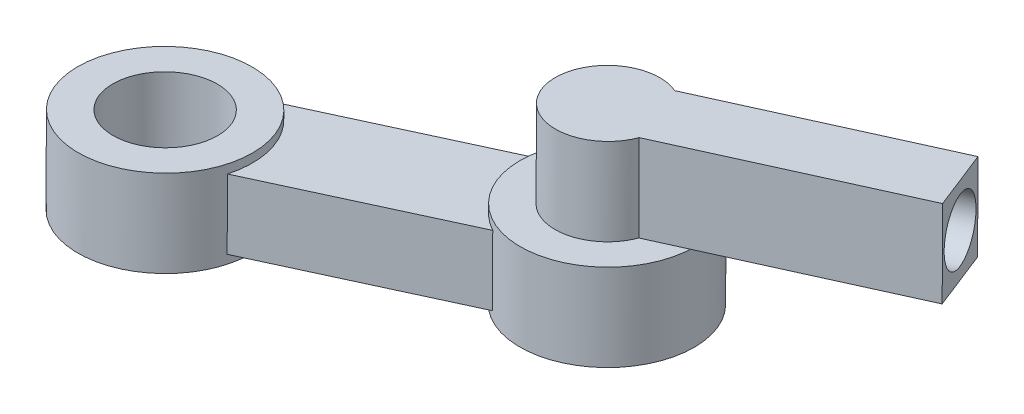
ISO-10303-21;
HEADER;
FILE_DESCRIPTION(('STEP AP214'),'2;1');
FILE_NAME('part.step','',(''),(''),'','','');
FILE_SCHEMA(('AUTOMOTIVE_DESIGN { 1 0 10303 214 1 1 1 1 }'));
ENDSEC;
DATA;
#1=APPLICATION_CONTEXT('core data for automotive mechanical design processes');
#2=APPLICATION_PROTOCOL_DEFINITION('international standard','automotive_design',2000,#1);
#3=PRODUCT_CONTEXT('',#1,'mechanical');
#4=PRODUCT('Part','Part','',(#3));
#5=PRODUCT_RELATED_PRODUCT_CATEGORY('part','',(#4));
#6=PRODUCT_DEFINITION_FORMATION('','',#4);
#7=PRODUCT_DEFINITION_CONTEXT('part definition',#1,'design');
#8=PRODUCT_DEFINITION('design','',#6,#7);
#9=PRODUCT_DEFINITION_SHAPE('','',#8);
#10=(LENGTH_UNIT() NAMED_UNIT(*) SI_UNIT(.MILLI.,.METRE.));
#11=(NAMED_UNIT(*) PLANE_ANGLE_UNIT() SI_UNIT($,.RADIAN.));
#12=(NAMED_UNIT(*) SI_UNIT($,.STERADIAN.) SOLID_ANGLE_UNIT());
#13=UNCERTAINTY_MEASURE_WITH_UNIT(LENGTH_MEASURE(1.E-05),#10,'distance_accuracy_value','');
#14=(GEOMETRIC_REPRESENTATION_CONTEXT(3) GLOBAL_UNCERTAINTY_ASSIGNED_CONTEXT((#13)) GLOBAL_UNIT_ASSIGNED_CONTEXT((#10,
#11,#12)) REPRESENTATION_CONTEXT('',''));
#15=CARTESIAN_POINT('',(0.,0.,0.));
#16=DIRECTION('',(0.,0.,1.));
#17=DIRECTION('',(1.,0.,0.));
#18=AXIS2_PLACEMENT_3D('',#15,#16,#17);
#19=CARTESIAN_POINT('',(151.701359540284,43.9127143912084,107.787056538677));
#20=DIRECTION('',(0.398693533684162,0.0497378245111538,0.915734467523929));
#21=DIRECTION('',(-0.0344593521490595,0.998635550345111,-0.0392376176186142));
#22=AXIS2_PLACEMENT_3D('',#19,#20,#21);
#23=PLANE('',#22);
#24=DIRECTION('',(-0.916436587685096,-0.0159118320697253,0.399863469639678));
#25=VECTOR('',#24,1.);
#26=CARTESIAN_POINT('',(152.390546583265,23.9400033843061,108.57180889105));
#27=LINE('',#26,#25);
#28=CARTESIAN_POINT('',(134.061814829564,23.6217667429116,116.569078283843));
#29=VERTEX_POINT('',#28);
#30=CARTESIAN_POINT('',(79.0756195684577,22.6670568187281,140.560886462224));
#31=VERTEX_POINT('',#30);
#32=EDGE_CURVE('P0_E65',#29,#31,#27,.T.);
#33=ORIENTED_EDGE('',*,*,#32,.F.);
#34=DIRECTION('',(0.0344593521490595,-0.998635550345111,0.0392376176186142));
#35=VECTOR('',#34,1.);
#36=CARTESIAN_POINT('',(133.28647940621,46.0910666256766,115.686231887424));
#37=LINE('',#36,#35);
#38=CARTESIAN_POINT('',(133.372627786582,43.5944777498139,115.784325931471));
#39=VERTEX_POINT('',#38);
#40=EDGE_CURVE('P0_E58',#29,#39,#37,.F.);
#41=ORIENTED_EDGE('',*,*,#40,.T.);
#42=DIRECTION('',(-0.916436587685096,-0.0159118320697253,0.399863469639678));
#43=VECTOR('',#42,1.);
#44=CARTESIAN_POINT('',(151.701359540284,43.9127143912084,107.787056538677));
#45=LINE('',#44,#43);
#46=CARTESIAN_POINT('',(78.3864325254766,42.6397678256303,139.776134109852));
#47=VERTEX_POINT('',#46);
#48=EDGE_CURVE('P0_E64',#39,#47,#45,.T.);
#49=ORIENTED_EDGE('',*,*,#48,.T.);
#50=DIRECTION('',(0.0344593521490595,-0.998635550345111,0.0392376176186142));
#51=VECTOR('',#50,1.);
#52=CARTESIAN_POINT('',(78.3002841451039,45.1363567014931,139.678040065805));
#53=LINE('',#52,#51);
#54=EDGE_CURVE('P0_E85',#31,#47,#53,.F.);
#55=ORIENTED_EDGE('',*,*,#54,.F.);
#56=EDGE_LOOP('',(#33,#41,#49,#55));
#57=FACE_BOUND('',#56,.T.);
#58=ADVANCED_FACE('P0_F17',(#57),#23,.T.);
#59=CARTESIAN_POINT('',(139.740553529759,42.4205796558737,80.3150225129594));
#60=DIRECTION('',(-0.398693533684162,-0.0497378245111538,-0.915734467523929));
#61=DIRECTION('',(0.0344593521490595,-0.998635550345111,0.0392376176186142));
#62=AXIS2_PLACEMENT_3D('',#59,#60,#61);
#63=PLANE('',#62);
#64=DIRECTION('',(-0.916436587685096,-0.0159118320697253,0.399863469639678));
#65=VECTOR('',#64,1.);
#66=CARTESIAN_POINT('',(139.740553529759,42.4205796558737,80.3150225129594));
#67=LINE('',#66,#65);
#68=CARTESIAN_POINT('',(121.411821776057,42.1023430144792,88.312291905753));
#69=VERTEX_POINT('',#68);
#70=CARTESIAN_POINT('',(66.4256265149517,41.1476330902957,112.304100084134));
#71=VERTEX_POINT('',#70);
#72=EDGE_CURVE('P0_E38',#69,#71,#67,.T.);
#73=ORIENTED_EDGE('',*,*,#72,.F.);
#74=DIRECTION('',(0.0344593521490595,-0.998635550345111,0.0392376176186142));
#75=VECTOR('',#74,1.);
#76=CARTESIAN_POINT('',(121.325673395685,44.598931890342,88.2141978617065));
#77=LINE('',#76,#75);
#78=CARTESIAN_POINT('',(122.101008819039,22.129632007577,89.0970442581253));
#79=VERTEX_POINT('',#78);
#80=EDGE_CURVE('P0_E32',#69,#79,#77,.T.);
#81=ORIENTED_EDGE('',*,*,#80,.T.);
#82=DIRECTION('',(-0.916436587685096,-0.0159118320697253,0.399863469639678));
#83=VECTOR('',#82,1.);
#84=CARTESIAN_POINT('',(140.429740572741,22.4478686489715,81.0997748653317));
#85=LINE('',#84,#83);
#86=CARTESIAN_POINT('',(67.1148135579329,21.1749220833935,113.088852436506));
#87=VERTEX_POINT('',#86);
#88=EDGE_CURVE('P0_E73',#79,#87,#85,.T.);
#89=ORIENTED_EDGE('',*,*,#88,.T.);
#90=DIRECTION('',(0.0344593521490595,-0.998635550345111,0.0392376176186142));
#91=VECTOR('',#90,1.);
#92=CARTESIAN_POINT('',(66.3394781345791,43.6442219661585,112.206006040087));
#93=LINE('',#92,#91);
#94=EDGE_CURVE('P0_E79',#71,#87,#93,.T.);
#95=ORIENTED_EDGE('',*,*,#94,.F.);
#96=EDGE_LOOP('',(#73,#81,#89,#95));
#97=FACE_BOUND('',#96,.T.);
#98=ADVANCED_FACE('P0_F121',(#97),#63,.T.);
#99=CARTESIAN_POINT('',(53.9911493861395,44.0720526924313,133.93929244574));
#100=DIRECTION('',(-0.0344593521490595,0.998635550345111,-0.0392376176186142));
#101=DIRECTION('',(-0.398693533684162,-0.0497378245111538,-0.915734467523929));
#102=AXIS2_PLACEMENT_3D('',#99,#100,#101);
#103=PLANE('',#102);
#104=CARTESIAN_POINT('',(53.9911493861395,44.0720526924313,133.93929244574));
#105=DIRECTION('',(-0.0344593521490595,0.998635550345111,-0.0392376176186142));
#106=DIRECTION('',(-0.398693533684162,-0.0497378245111538,-0.915734467523929));
#107=AXIS2_PLACEMENT_3D('',#104,#105,#106);
#108=CIRCLE('',#107,25.);
#109=CARTESIAN_POINT('',(44.0238110440355,42.8286070796525,111.045930757641));
#110=VERTEX_POINT('',#109);
#111=EDGE_CURVE('P0_E25',#110,#110,#108,.T.);
#112=ORIENTED_EDGE('',*,*,#111,.T.);
#113=EDGE_LOOP('',(#112));
#114=FACE_BOUND('',#113,.T.);
#115=CARTESIAN_POINT('',(53.9911493861395,44.0720526924313,133.93929244574));
#116=DIRECTION('',(-0.0344593521490595,0.998635550345111,-0.0392376176186142));
#117=DIRECTION('',(-0.398693533684162,-0.0497378245111538,-0.915734467523929));
#118=AXIS2_PLACEMENT_3D('',#115,#116,#117);
#119=CIRCLE('',#118,15.);
#120=CARTESIAN_POINT('',(59.971552391402,44.8181200600986,147.675309458599));
#121=VERTEX_POINT('',#120);
#122=EDGE_CURVE('P0_E88',#121,#121,#119,.T.);
#123=ORIENTED_EDGE('',*,*,#122,.F.);
#124=EDGE_LOOP('',(#123));
#125=FACE_BOUND('',#124,.T.);
#126=ADVANCED_FACE('P0_F102',(#114,#125),#103,.T.);
#127=CARTESIAN_POINT('',(54.852633189866,19.1061639338035,134.920232886205));
#128=DIRECTION('',(-0.0344593521490595,0.998635550345111,-0.0392376176186142));
#129=DIRECTION('',(-0.398693533684162,-0.0497378245111538,-0.915734467523929));
#130=AXIS2_PLACEMENT_3D('',#127,#128,#129);
#131=PLANE('',#130);
#132=CARTESIAN_POINT('',(54.852633189866,19.1061639338035,134.920232886205));
#133=DIRECTION('',(-0.0344593521490595,0.998635550345111,-0.0392376176186142));
#134=DIRECTION('',(-0.398693533684162,-0.0497378245111538,-0.915734467523929));
#135=AXIS2_PLACEMENT_3D('',#132,#133,#134);
#136=CIRCLE('',#135,25.);
#137=CARTESIAN_POINT('',(44.885294847762,17.8627183210247,112.026871198107));
#138=VERTEX_POINT('',#137);
#139=EDGE_CURVE('P0_E91',#138,#138,#136,.T.);
#140=ORIENTED_EDGE('',*,*,#139,.F.);
#141=EDGE_LOOP('',(#140));
#142=FACE_BOUND('',#141,.T.);
#143=CARTESIAN_POINT('',(54.852633189866,19.1061639338035,134.920232886205));
#144=DIRECTION('',(-0.0344593521490595,0.998635550345111,-0.0392376176186142));
#145=DIRECTION('',(-0.398693533684162,-0.0497378245111538,-0.915734467523929));
#146=AXIS2_PLACEMENT_3D('',#143,#144,#145);
#147=CIRCLE('',#146,15.);
#148=CARTESIAN_POINT('',(60.8330361951285,19.8522313014708,148.656249899064));
#149=VERTEX_POINT('',#148);
#150=EDGE_CURVE('P0_E87',#149,#149,#147,.T.);
#151=ORIENTED_EDGE('',*,*,#150,.T.);
#152=EDGE_LOOP('',(#151));
#153=FACE_BOUND('',#152,.T.);
#154=ADVANCED_FACE('P0_F99',(#142,#153),#131,.F.);
#155=CARTESIAN_POINT('',(53.9911493861395,44.0720526924313,133.93929244574));
#156=DIRECTION('',(0.0344593521490595,-0.998635550345111,0.0392376176186142));
#157=DIRECTION('',(0.398693533684162,0.0497378245111538,0.915734467523929));
#158=AXIS2_PLACEMENT_3D('',#155,#156,#157);
#159=CYLINDRICAL_SURFACE('',#158,25.);
#160=CARTESIAN_POINT('',(54.7664848094934,21.6027528096663,134.822138842158));
#161=DIRECTION('',(0.0344593521490596,-0.998635550345111,0.0392376176186143));
#162=DIRECTION('',(0.398693533684162,0.0497378245111539,0.915734467523929));
#163=AXIS2_PLACEMENT_3D('',#160,#161,#162);
#164=CIRCLE('',#163,25.);
#165=EDGE_CURVE('P0_E82',#87,#31,#164,.T.);
#166=ORIENTED_EDGE('',*,*,#165,.T.);
#167=ORIENTED_EDGE('',*,*,#54,.T.);
#168=CARTESIAN_POINT('',(54.0772977665122,41.5754638165685,134.037386489786));
#169=DIRECTION('',(-0.0344593521490596,0.998635550345111,-0.0392376176186143));
#170=DIRECTION('',(-0.398693533684162,-0.0497378245111539,-0.915734467523929));
#171=AXIS2_PLACEMENT_3D('',#168,#169,#170);
#172=CIRCLE('',#171,25.);
#173=EDGE_CURVE('P0_E70',#47,#71,#172,.T.);
#174=ORIENTED_EDGE('',*,*,#173,.T.);
#175=ORIENTED_EDGE('',*,*,#94,.T.);
#176=EDGE_LOOP('',(#166,#167,#174,#175));
#177=FACE_BOUND('',#176,.T.);
#178=ORIENTED_EDGE('',*,*,#111,.F.);
#179=EDGE_LOOP('',(#178));
#180=FACE_BOUND('',#179,.T.);
#181=ORIENTED_EDGE('',*,*,#139,.T.);
#182=EDGE_LOOP('',(#181));
#183=FACE_BOUND('',#182,.T.);
#184=ADVANCED_FACE('P0_F19',(#177,#180,#183),#159,.T.);
#185=CARTESIAN_POINT('',(53.9911493861395,44.0720526924313,133.93929244574));
#186=DIRECTION('',(0.0344593521490595,-0.998635550345111,0.0392376176186142));
#187=DIRECTION('',(0.398693533684162,0.0497378245111538,0.915734467523929));
#188=AXIS2_PLACEMENT_3D('',#185,#186,#187);
#189=CYLINDRICAL_SURFACE('',#188,15.);
#190=CARTESIAN_POINT('',(59.971552391402,44.8181200600986,147.675309458599));
#191=CARTESIAN_POINT('',(59.9805261810241,44.5580587188629,147.685527588187));
#192=CARTESIAN_POINT('',(59.9894999706463,44.2979973776272,147.695745717775));
#193=CARTESIAN_POINT('',(60.0074475498906,43.7778746951558,147.716181976951));
#194=CARTESIAN_POINT('',(60.0164213395127,43.5178133539201,147.726400106539));
#195=CARTESIAN_POINT('',(60.034368918757,42.9976906714487,147.746836365716));
#196=CARTESIAN_POINT('',(60.0433427083792,42.737629330213,147.757054495304));
#197=CARTESIAN_POINT('',(60.0612902876235,42.2175066477416,147.77749075448));
#198=CARTESIAN_POINT('',(60.0702640772456,41.9574453065058,147.787708884069));
#199=CARTESIAN_POINT('',(60.0882116564899,41.4373226240344,147.808145143245));
#200=CARTESIAN_POINT('',(60.0971854461121,41.1772612827987,147.818363272833));
#201=CARTESIAN_POINT('',(60.1151330253564,40.6571386003273,147.838799532009));
#202=CARTESIAN_POINT('',(60.1241068149785,40.3970772590916,147.849017661598));
#203=CARTESIAN_POINT('',(60.1420543942228,39.8769545766202,147.869453920774));
#204=CARTESIAN_POINT('',(60.151028183845,39.6168932353845,147.879672050362));
#205=CARTESIAN_POINT('',(60.1689757630893,39.0967705529131,147.900108309539));
#206=CARTESIAN_POINT('',(60.1779495527114,38.8367092116774,147.910326439127));
#207=CARTESIAN_POINT('',(60.1958971319558,38.316586529206,147.930762698303));
#208=CARTESIAN_POINT('',(60.2048709215779,38.0565251879703,147.940980827891));
#209=CARTESIAN_POINT('',(60.2228185008222,37.5364025054988,147.961417087068));
#210=CARTESIAN_POINT('',(60.2317922904443,37.2763411642631,147.971635216656));
#211=CARTESIAN_POINT('',(60.2497398696887,36.7562184817917,147.992071475832));
#212=CARTESIAN_POINT('',(60.2587136593108,36.496157140556,148.00228960542));
#213=CARTESIAN_POINT('',(60.2766612385551,35.9760344580846,148.022725864597));
#214=CARTESIAN_POINT('',(60.2856350281773,35.7159731168489,148.032943994185));
#215=CARTESIAN_POINT('',(60.3035826074216,35.1958504343775,148.053380253361));
#216=CARTESIAN_POINT('',(60.3125563970437,34.9357890931418,148.063598382949));
#217=CARTESIAN_POINT('',(60.330503976288,34.4156664106704,148.084034642126));
#218=CARTESIAN_POINT('',(60.3394777659102,34.1556050694347,148.094252771714));
#219=CARTESIAN_POINT('',(60.3574253451545,33.6354823869632,148.11468903089));
#220=CARTESIAN_POINT('',(60.3663991347766,33.3754210457275,148.124907160479));
#221=CARTESIAN_POINT('',(60.3843467140209,32.8552983632561,148.145343419655));
#222=CARTESIAN_POINT('',(60.3933205036431,32.5952370220204,148.155561549243));
#223=CARTESIAN_POINT('',(60.4112680828874,32.075114339549,148.175997808419));
#224=CARTESIAN_POINT('',(60.4202418725095,31.8150529983133,148.186215938008));
#225=CARTESIAN_POINT('',(60.4381894517538,31.2949303158419,148.206652197184));
#226=CARTESIAN_POINT('',(60.447163241376,31.0348689746062,148.216870326772));
#227=CARTESIAN_POINT('',(60.4651108206203,30.5147462921348,148.237306585949));
#228=CARTESIAN_POINT('',(60.4740846102424,30.2546849508991,148.247524715537));
#229=CARTESIAN_POINT('',(60.4920321894867,29.7345622684277,148.267960974713));
#230=CARTESIAN_POINT('',(60.5010059791089,29.474500927192,148.278179104301));
#231=CARTESIAN_POINT('',(60.5189535583532,28.9543782447205,148.298615363478));
#232=CARTESIAN_POINT('',(60.5279273479753,28.6943169034848,148.308833493066));
#233=CARTESIAN_POINT('',(60.5458749272196,28.1741942210134,148.329269752242));
#234=CARTESIAN_POINT('',(60.5548487168418,27.9141328797777,148.33948788183));
#235=CARTESIAN_POINT('',(60.5727962960861,27.3940101973063,148.359924141007));
#236=CARTESIAN_POINT('',(60.5817700857082,27.1339488560706,148.370142270595));
#237=CARTESIAN_POINT('',(60.5997176649525,26.6138261735992,148.390578529771));
#238=CARTESIAN_POINT('',(60.6086914545747,26.3537648323635,148.400796659359));
#239=CARTESIAN_POINT('',(60.626639033819,25.8336421498921,148.421232918536));
#240=CARTESIAN_POINT('',(60.6356128234411,25.5735808086564,148.431451048124));
#241=CARTESIAN_POINT('',(60.6535604026854,25.053458126185,148.4518873073));
#242=CARTESIAN_POINT('',(60.6625341923076,24.7933967849492,148.462105436889));
#243=CARTESIAN_POINT('',(60.6804817715519,24.2732741024778,148.482541696065));
#244=CARTESIAN_POINT('',(60.6894555611741,24.0132127612421,148.492759825653));
#245=CARTESIAN_POINT('',(60.7074031404183,23.4930900787707,148.513196084829));
#246=CARTESIAN_POINT('',(60.7163769300405,23.233028737535,148.523414214418));
#247=CARTESIAN_POINT('',(60.7343245092848,22.7129060550636,148.543850473594));
#248=CARTESIAN_POINT('',(60.743298298907,22.4528447138279,148.554068603182));
#249=CARTESIAN_POINT('',(60.7612458781513,21.9327220313565,148.574504862358));
#250=CARTESIAN_POINT('',(60.7702196677734,21.6726606901208,148.584722991947));
#251=CARTESIAN_POINT('',(60.7881672470177,21.1525380076494,148.605159251123));
#252=CARTESIAN_POINT('',(60.7971410366399,20.8924766664137,148.615377380711));
#253=CARTESIAN_POINT('',(60.8150886158842,20.3723539839422,148.635813639888));
#254=CARTESIAN_POINT('',(60.8240624055063,20.1122926427065,148.646031769476));
#255=CARTESIAN_POINT('',(60.8330361951285,19.8522313014708,148.656249899064));
#256=B_SPLINE_CURVE_WITH_KNOTS('',3,(#190,#191,#192,#193,#194,#195,#196,#197,#198,#199,#200,
#201,#202,#203,#204,#205,#206,#207,#208,#209,#210,#211,#212,#213,#214,#215,#216,#217,#218,#219,
#220,#221,#222,#223,#224,#225,#226,#227,#228,#229,#230,#231,#232,#233,#234,#235,#236,#237,#238,
#239,#240,#241,#242,#243,#244,#245,#246,#247,#248,#249,#250,#251,#252,#253,#254,#255),
.UNSPECIFIED.,.F.,.F.,(4,2,2,2,2,2,2,2,2,2,2,2,2,2,2,2,2,2,2,2,2,2,2,2,2,2,2,2,2,2,2,2,4),(0.,
0.781250000000005,1.5625,2.34375,3.125,3.90625,4.6875,5.46875000000001,6.25000000000001,7.03125,
7.81250000000001,8.59375000000001,9.37500000000001,10.15625,10.9375,11.71875,12.5,13.28125,
14.0625,14.84375,15.625,16.40625,17.1875,17.96875,18.75,19.53125,20.3125,21.09375,21.875,
22.65625,23.4375,24.21875,25.),.UNSPECIFIED.);
#257=EDGE_CURVE('P0_BSEAM105',#121,#149,#256,.T.);
#258=ORIENTED_EDGE('',*,*,#122,.T.);
#259=ORIENTED_EDGE('',*,*,#150,.F.);
#260=ORIENTED_EDGE('',*,*,#257,.T.);
#261=ORIENTED_EDGE('',*,*,#257,.F.);
#262=EDGE_LOOP('',(#258,#260,#259,#261));
#263=FACE_BOUND('',#262,.T.);
#264=ADVANCED_FACE('P0_F105',(#263),#189,.F.);
#265=CARTESIAN_POINT('',(140.429740572741,22.4478686489715,81.0997748653317));
#266=DIRECTION('',(0.0344593521490596,-0.998635550345111,0.0392376176186143));
#267=DIRECTION('',(0.398693533684162,0.0497378245111539,0.915734467523929));
#268=AXIS2_PLACEMENT_3D('',#265,#266,#267);
#269=PLANE('',#268);
#270=ORIENTED_EDGE('',*,*,#88,.F.);
#271=CARTESIAN_POINT('',(146.410143578003,23.1939360166388,94.8357918781907));
#272=DIRECTION('',(0.0344593521490596,-0.998635550345111,0.0392376176186143));
#273=DIRECTION('',(0.398693533684162,0.0497378245111539,0.915734467523929));
#274=AXIS2_PLACEMENT_3D('',#271,#272,#273);
#275=CIRCLE('',#274,25.);
#276=EDGE_CURVE('P0_E66',#79,#29,#275,.F.);
#277=ORIENTED_EDGE('',*,*,#276,.T.);
#278=ORIENTED_EDGE('',*,*,#32,.T.);
#279=ORIENTED_EDGE('',*,*,#165,.F.);
#280=EDGE_LOOP('',(#270,#277,#278,#279));
#281=FACE_BOUND('',#280,.T.);
#282=ADVANCED_FACE('P0_F107',(#281),#269,.T.);
#283=CARTESIAN_POINT('',(139.740553529759,42.4205796558737,80.3150225129594));
#284=DIRECTION('',(-0.0344593521490596,0.998635550345111,-0.0392376176186143));
#285=DIRECTION('',(-0.398693533684162,-0.0497378245111539,-0.915734467523929));
#286=AXIS2_PLACEMENT_3D('',#283,#284,#285);
#287=PLANE('',#286);
#288=ORIENTED_EDGE('',*,*,#48,.F.);
#289=CARTESIAN_POINT('',(145.720956535022,43.166647023541,94.0510395258184));
#290=DIRECTION('',(-0.0344593521490596,0.998635550345111,-0.0392376176186143));
#291=DIRECTION('',(-0.398693533684162,-0.0497378245111539,-0.915734467523929));
#292=AXIS2_PLACEMENT_3D('',#289,#290,#291);
#293=CIRCLE('',#292,25.);
#294=EDGE_CURVE('P0_E11',#39,#69,#293,.F.);
#295=ORIENTED_EDGE('',*,*,#294,.T.);
#296=ORIENTED_EDGE('',*,*,#72,.T.);
#297=ORIENTED_EDGE('',*,*,#173,.F.);
#298=EDGE_LOOP('',(#288,#295,#296,#297));
#299=FACE_BOUND('',#298,.T.);
#300=ADVANCED_FACE('P0_F68',(#299),#287,.T.);
#301=CARTESIAN_POINT('',(145.634808154649,45.6632358994038,93.9529454817718));
#302=DIRECTION('',(0.0344593521490595,-0.998635550345111,0.0392376176186142));
#303=DIRECTION('',(0.398693533684162,0.0497378245111538,0.915734467523929));
#304=AXIS2_PLACEMENT_3D('',#301,#302,#303);
#305=CYLINDRICAL_SURFACE('',#304,15.);
#306=CARTESIAN_POINT('',(146.496291958376,20.6973471407761,94.9338859222372));
#307=DIRECTION('',(-0.0344593521490595,0.998635550345111,-0.0392376176186142));
#308=DIRECTION('',(-0.398693533684162,-0.0497378245111538,-0.915734467523929));
#309=AXIS2_PLACEMENT_3D('',#306,#307,#308);
#310=CIRCLE('',#309,15.);
#311=CARTESIAN_POINT('',(152.476694963638,21.4434145084434,108.669902935096));
#312=VERTEX_POINT('',#311);
#313=EDGE_CURVE('P0_E148',#312,#312,#310,.T.);
#314=CARTESIAN_POINT('',(145.634808154649,45.6632358994038,93.9529454817718));
#315=DIRECTION('',(-0.0344593521490595,0.998635550345111,-0.0392376176186142));
#316=DIRECTION('',(-0.398693533684162,-0.0497378245111538,-0.915734467523929));
#317=AXIS2_PLACEMENT_3D('',#314,#315,#316);
#318=CIRCLE('',#317,15.);
#319=CARTESIAN_POINT('',(151.615211159912,46.4093032670711,107.688962494631));
#320=VERTEX_POINT('',#319);
#321=EDGE_CURVE('P0_E151',#320,#320,#318,.T.);
#322=CARTESIAN_POINT('',(152.476694963638,21.4434145084434,108.669902935096));
#323=CARTESIAN_POINT('',(152.467721174016,21.7034758496791,108.659684805508));
#324=CARTESIAN_POINT('',(152.458747384394,21.9635371909148,108.64946667592));
#325=CARTESIAN_POINT('',(152.440799805149,22.4836598733862,108.629030416743));
#326=CARTESIAN_POINT('',(152.431826015527,22.7437212146219,108.618812287155));
#327=CARTESIAN_POINT('',(152.413878436283,23.2638438970933,108.598376027979));
#328=CARTESIAN_POINT('',(152.404904646661,23.523905238329,108.588157898391));
#329=CARTESIAN_POINT('',(152.386957067417,24.0440279208004,108.567721639214));
#330=CARTESIAN_POINT('',(152.377983277794,24.3040892620361,108.557503509626));
#331=CARTESIAN_POINT('',(152.36003569855,24.8242119445075,108.53706725045));
#332=CARTESIAN_POINT('',(152.351061908928,25.0842732857432,108.526849120862));
#333=CARTESIAN_POINT('',(152.333114329684,25.6043959682147,108.506412861685));
#334=CARTESIAN_POINT('',(152.324140540061,25.8644573094504,108.496194732097));
#335=CARTESIAN_POINT('',(152.306192960817,26.3845799919218,108.475758472921));
#336=CARTESIAN_POINT('',(152.297219171195,26.6446413331575,108.465540343332));
#337=CARTESIAN_POINT('',(152.279271591951,27.1647640156289,108.445104084156));
#338=CARTESIAN_POINT('',(152.270297802329,27.4248253568646,108.434885954568));
#339=CARTESIAN_POINT('',(152.252350223084,27.944948039336,108.414449695392));
#340=CARTESIAN_POINT('',(152.243376433462,28.2050093805717,108.404231565803));
#341=CARTESIAN_POINT('',(152.225428854218,28.7251320630431,108.383795306627));
#342=CARTESIAN_POINT('',(152.216455064596,28.9851934042788,108.373577177039));
#343=CARTESIAN_POINT('',(152.198507485351,29.5053160867502,108.353140917863));
#344=CARTESIAN_POINT('',(152.189533695729,29.7653774279859,108.342922788274));
#345=CARTESIAN_POINT('',(152.171586116485,30.2855001104574,108.322486529098));
#346=CARTESIAN_POINT('',(152.162612326863,30.5455614516931,108.31226839951));
#347=CARTESIAN_POINT('',(152.144664747619,31.0656841341645,108.291832140333));
#348=CARTESIAN_POINT('',(152.135690957996,31.3257454754002,108.281614010745));
#349=CARTESIAN_POINT('',(152.117743378752,31.8458681578716,108.261177751569));
#350=CARTESIAN_POINT('',(152.10876958913,32.1059294991073,108.250959621981));
#351=CARTESIAN_POINT('',(152.090822009886,32.6260521815787,108.230523362804));
#352=CARTESIAN_POINT('',(152.081848220263,32.8861135228144,108.220305233216));
#353=CARTESIAN_POINT('',(152.063900641019,33.4062362052858,108.19986897404));
#354=CARTESIAN_POINT('',(152.054926851397,33.6662975465215,108.189650844452));
#355=CARTESIAN_POINT('',(152.036979272153,34.186420228993,108.169214585275));
#356=CARTESIAN_POINT('',(152.028005482531,34.4464815702287,108.158996455687));
#357=CARTESIAN_POINT('',(152.010057903286,34.9666042527001,108.138560196511));
#358=CARTESIAN_POINT('',(152.001084113664,35.2266655939358,108.128342066923));
#359=CARTESIAN_POINT('',(151.98313653442,35.7467882764072,108.107905807746));
#360=CARTESIAN_POINT('',(151.974162744798,36.0068496176429,108.097687678158));
#361=CARTESIAN_POINT('',(151.956215165553,36.5269723001143,108.077251418982));
#362=CARTESIAN_POINT('',(151.947241375931,36.78703364135,108.067033289393));
#363=CARTESIAN_POINT('',(151.929293796687,37.3071563238214,108.046597030217));
#364=CARTESIAN_POINT('',(151.920320007065,37.5672176650571,108.036378900629));
#365=CARTESIAN_POINT('',(151.90237242782,38.0873403475285,108.015942641453));
#366=CARTESIAN_POINT('',(151.893398638198,38.3474016887643,108.005724511864));
#367=CARTESIAN_POINT('',(151.875451058954,38.8675243712357,107.985288252688));
#368=CARTESIAN_POINT('',(151.866477269332,39.1275857124714,107.9750701231));
#369=CARTESIAN_POINT('',(151.848529690088,39.6477083949428,107.954633863923));
#370=CARTESIAN_POINT('',(151.839555900465,39.9077697361785,107.944415734335));
#371=CARTESIAN_POINT('',(151.821608321221,40.4278924186499,107.923979475159));
#372=CARTESIAN_POINT('',(151.812634531599,40.6879537598856,107.913761345571));
#373=CARTESIAN_POINT('',(151.794686952355,41.208076442357,107.893325086394));
#374=CARTESIAN_POINT('',(151.785713162732,41.4681377835927,107.883106956806));
#375=CARTESIAN_POINT('',(151.767765583488,41.9882604660641,107.86267069763));
#376=CARTESIAN_POINT('',(151.758791793866,42.2483218072998,107.852452568042));
#377=CARTESIAN_POINT('',(151.740844214622,42.7684444897712,107.832016308865));
#378=CARTESIAN_POINT('',(151.731870425,43.028505831007,107.821798179277));
#379=CARTESIAN_POINT('',(151.713922845755,43.5486285134784,107.801361920101));
#380=CARTESIAN_POINT('',(151.704949056133,43.8086898547141,107.791143790513));
#381=CARTESIAN_POINT('',(151.687001476889,44.3288125371855,107.770707531336));
#382=CARTESIAN_POINT('',(151.678027687267,44.5888738784212,107.760489401748));
#383=CARTESIAN_POINT('',(151.660080108022,45.1089965608926,107.740053142572));
#384=CARTESIAN_POINT('',(151.6511063184,45.3690579021283,107.729835012983));
#385=CARTESIAN_POINT('',(151.633158739156,45.8891805845997,107.709398753807));
#386=CARTESIAN_POINT('',(151.624184949534,46.1492419258354,107.699180624219));
#387=CARTESIAN_POINT('',(151.615211159912,46.4093032670711,107.688962494631));
#388=B_SPLINE_CURVE_WITH_KNOTS('',3,(#322,#323,#324,#325,#326,#327,#328,#329,#330,#331,#332,
#333,#334,#335,#336,#337,#338,#339,#340,#341,#342,#343,#344,#345,#346,#347,#348,#349,#350,#351,
#352,#353,#354,#355,#356,#357,#358,#359,#360,#361,#362,#363,#364,#365,#366,#367,#368,#369,#370,
#371,#372,#373,#374,#375,#376,#377,#378,#379,#380,#381,#382,#383,#384,#385,#386,#387),
.UNSPECIFIED.,.F.,.F.,(4,2,2,2,2,2,2,2,2,2,2,2,2,2,2,2,2,2,2,2,2,2,2,2,2,2,2,2,2,2,2,2,4),(0.,
0.781250000000001,1.5625,2.34375,3.125,3.90625,4.6875,5.46875,6.25,7.03125,7.8125,8.59375,9.375,
10.15625,10.9375,11.71875,12.5,13.28125,14.0625,14.84375,15.625,16.40625,17.1875,17.96875,18.75,
19.53125,20.3125,21.09375,21.875,22.65625,23.4375,24.21875,25.),.UNSPECIFIED.);
#389=EDGE_CURVE('P0_BSEAM129',#312,#320,#388,.T.);
#390=ORIENTED_EDGE('',*,*,#313,.F.);
#391=ORIENTED_EDGE('',*,*,#321,.T.);
#392=ORIENTED_EDGE('',*,*,#389,.T.);
#393=ORIENTED_EDGE('',*,*,#389,.F.);
#394=EDGE_LOOP('',(#390,#392,#391,#393));
#395=FACE_BOUND('',#394,.T.);
#396=ADVANCED_FACE('P0_F129',(#395),#305,.F.);
#397=CARTESIAN_POINT('',(145.634808154649,45.6632358994038,93.9529454817718));
#398=DIRECTION('',(-0.0344593521490595,0.998635550345111,-0.0392376176186142));
#399=DIRECTION('',(-0.398693533684162,-0.0497378245111538,-0.915734467523929));
#400=AXIS2_PLACEMENT_3D('',#397,#398,#399);
#401=PLANE('',#400);
#402=CARTESIAN_POINT('',(145.634808154649,45.6632358994038,93.9529454817718));
#403=DIRECTION('',(-0.0344593521490595,0.998635550345111,-0.0392376176186142));
#404=DIRECTION('',(-0.398693533684162,-0.0497378245111538,-0.915734467523929));
#405=AXIS2_PLACEMENT_3D('',#402,#403,#404);
#406=CIRCLE('',#405,25.);
#407=CARTESIAN_POINT('',(135.667469812545,44.419790286625,71.0595837936736));
#408=VERTEX_POINT('',#407);
#409=EDGE_CURVE('P0_E156',#408,#408,#406,.T.);
#410=ORIENTED_EDGE('',*,*,#409,.T.);
#411=EDGE_LOOP('',(#410));
#412=FACE_BOUND('',#411,.T.);
#413=ORIENTED_EDGE('',*,*,#321,.F.);
#414=EDGE_LOOP('',(#413));
#415=FACE_BOUND('',#414,.T.);
#416=ADVANCED_FACE('P0_F136',(#412,#415),#401,.T.);
#417=CARTESIAN_POINT('',(146.496291958376,20.6973471407761,94.9338859222372));
#418=DIRECTION('',(-0.0344593521490595,0.998635550345111,-0.0392376176186142));
#419=DIRECTION('',(-0.398693533684162,-0.0497378245111538,-0.915734467523929));
#420=AXIS2_PLACEMENT_3D('',#417,#418,#419);
#421=PLANE('',#420);
#422=CARTESIAN_POINT('',(146.496291958376,20.6973471407761,94.9338859222372));
#423=DIRECTION('',(-0.0344593521490595,0.998635550345111,-0.0392376176186142));
#424=DIRECTION('',(-0.398693533684162,-0.0497378245111538,-0.915734467523929));
#425=AXIS2_PLACEMENT_3D('',#422,#423,#424);
#426=CIRCLE('',#425,25.);
#427=CARTESIAN_POINT('',(136.528953616272,19.4539015279972,72.040524234139));
#428=VERTEX_POINT('',#427);
#429=EDGE_CURVE('P0_E153',#428,#428,#426,.T.);
#430=ORIENTED_EDGE('',*,*,#429,.F.);
#431=EDGE_LOOP('',(#430));
#432=FACE_BOUND('',#431,.T.);
#433=ORIENTED_EDGE('',*,*,#313,.T.);
#434=EDGE_LOOP('',(#433));
#435=FACE_BOUND('',#434,.T.);
#436=ADVANCED_FACE('P0_F133',(#432,#435),#421,.F.);
#437=CARTESIAN_POINT('',(145.634808154649,45.6632358994038,93.9529454817718));
#438=DIRECTION('',(0.0344593521490595,-0.998635550345111,0.0392376176186142));
#439=DIRECTION('',(0.398693533684162,0.0497378245111538,0.915734467523929));
#440=AXIS2_PLACEMENT_3D('',#437,#438,#439);
#441=CYLINDRICAL_SURFACE('',#440,25.);
#442=ORIENTED_EDGE('',*,*,#276,.F.);
#443=ORIENTED_EDGE('',*,*,#80,.F.);
#444=ORIENTED_EDGE('',*,*,#294,.F.);
#445=ORIENTED_EDGE('',*,*,#40,.F.);
#446=EDGE_LOOP('',(#442,#443,#444,#445));
#447=FACE_BOUND('',#446,.T.);
#448=ORIENTED_EDGE('',*,*,#409,.F.);
#449=EDGE_LOOP('',(#448));
#450=FACE_BOUND('',#449,.T.);
#451=ORIENTED_EDGE('',*,*,#429,.T.);
#452=EDGE_LOOP('',(#451));
#453=FACE_BOUND('',#452,.T.);
#454=ADVANCED_FACE('P0_F56',(#447,#450,#453),#441,.T.);
#455=CLOSED_SHELL('',(#58,#98,#126,#154,#184,#264,#282,#300,#396,#416,#436,#454));
#456=MANIFOLD_SOLID_BREP('P0_B1',#455);
#457=CARTESIAN_POINT('',(146.496291958376,20.6973471407763,94.9338859222374));
#458=DIRECTION('',(-0.0344593521490585,0.998635550345111,-0.0392376176186136));
#459=DIRECTION('',(-0.391507522289047,-0.0496117439984364,-0.918836511490768));
#460=AXIS2_PLACEMENT_3D('',#457,#458,#459);
#461=CYLINDRICAL_SURFACE('',#460,15.);
#462=DIRECTION('',(-0.0344593521490585,0.998635550345111,-0.0392376176186136));
#463=VECTOR('',#462,1.);
#464=CARTESIAN_POINT('',(160.692018990858,21.3757118181715,99.7319225398244));
#465=LINE('',#464,#463);
#466=CARTESIAN_POINT('',(158.969051383405,71.3074893354271,97.7700416588937));
#467=VERTEX_POINT('',#466);
#468=CARTESIAN_POINT('',(159.830535187132,46.3416005767993,98.750982099359));
#469=VERTEX_POINT('',#468);
#470=EDGE_CURVE('P1_E91',#467,#469,#465,.F.);
#471=ORIENTED_EDGE('',*,*,#470,.F.);
#472=CARTESIAN_POINT('',(144.773324350923,70.6291246580319,92.9720050413067));
#473=DIRECTION('',(-0.0344593521490585,0.998635550345111,-0.0392376176186136));
#474=DIRECTION('',(-0.391507522289047,-0.0496117439984364,-0.918836511490768));
#475=AXIS2_PLACEMENT_3D('',#472,#473,#474);
#476=CIRCLE('',#475,15.);
#477=CARTESIAN_POINT('',(151.138900937624,70.3152544554583,79.3933114290783));
#478=VERTEX_POINT('',#477);
#479=EDGE_CURVE('P1_E93',#478,#467,#476,.T.);
#480=ORIENTED_EDGE('',*,*,#479,.F.);
#481=DIRECTION('',(-0.0344593521490585,0.998635550345111,-0.0392376176186136));
#482=VECTOR('',#481,1.);
#483=CARTESIAN_POINT('',(152.861868545077,20.3834769382028,81.355192310009));
#484=LINE('',#483,#482);
#485=CARTESIAN_POINT('',(152.000384741351,45.3493656968306,80.3742518695437));
#486=VERTEX_POINT('',#485);
#487=EDGE_CURVE('P1_E33',#486,#478,#484,.T.);
#488=ORIENTED_EDGE('',*,*,#487,.F.);
#489=CARTESIAN_POINT('',(145.634808154649,45.6632358994041,93.9529454817721));
#490=DIRECTION('',(0.0344593521490585,-0.998635550345111,0.0392376176186136));
#491=DIRECTION('',(0.391507522289047,0.0496117439984364,0.918836511490768));
#492=AXIS2_PLACEMENT_3D('',#489,#490,#491);
#493=CIRCLE('',#492,15.);
#494=EDGE_CURVE('P1_E10',#469,#486,#493,.F.);
#495=ORIENTED_EDGE('',*,*,#494,.F.);
#496=EDGE_LOOP('',(#471,#480,#488,#495));
#497=FACE_BOUND('',#496,.T.);
#498=CARTESIAN_POINT('',(146.496291958376,20.6973471407763,94.9338859222374));
#499=DIRECTION('',(-0.0344593521490585,0.998635550345111,-0.0392376176186136));
#500=DIRECTION('',(-0.391507522289047,-0.0496117439984364,-0.918836511490768));
#501=AXIS2_PLACEMENT_3D('',#498,#499,#500);
#502=CIRCLE('',#501,15.);
#503=CARTESIAN_POINT('',(140.62367912404,19.9531709807998,81.1513382498759));
#504=VERTEX_POINT('',#503);
#505=EDGE_CURVE('P1_E23',#504,#504,#502,.T.);
#506=ORIENTED_EDGE('',*,*,#505,.T.);
#507=EDGE_LOOP('',(#506));
#508=FACE_BOUND('',#507,.T.);
#509=ADVANCED_FACE('P1_F16',(#497,#508),#461,.T.);
#510=CARTESIAN_POINT('',(146.496291958376,20.6973471407763,94.9338859222374));
#511=DIRECTION('',(-0.0344593521490585,0.998635550345111,-0.0392376176186136));
#512=DIRECTION('',(-0.391507522289047,-0.0496117439984364,-0.918836511490768));
#513=AXIS2_PLACEMENT_3D('',#510,#511,#512);
#514=PLANE('',#513);
#515=ORIENTED_EDGE('',*,*,#505,.F.);
#516=EDGE_LOOP('',(#515));
#517=FACE_BOUND('',#516,.T.);
#518=ADVANCED_FACE('P1_F109',(#517),#514,.F.);
#519=CARTESIAN_POINT('',(144.773324350923,70.6291246580319,92.9720050413067));
#520=DIRECTION('',(-0.0344593521490585,0.998635550345111,-0.0392376176186136));
#521=DIRECTION('',(-0.391507522289047,-0.0496117439984364,-0.918836511490768));
#522=AXIS2_PLACEMENT_3D('',#519,#520,#521);
#523=PLANE('',#522);
#524=ORIENTED_EDGE('',*,*,#479,.T.);
#525=DIRECTION('',(-0.919529451970168,-0.0163006884624844,0.392682918542545));
#526=VECTOR('',#525,1.);
#527=CARTESIAN_POINT('',(222.250755731427,72.429297175015,70.7457366728108));
#528=LINE('',#527,#526);
#529=CARTESIAN_POINT('',(222.250755731427,72.429297175015,70.7457366728108));
#530=VERTEX_POINT('',#529);
#531=EDGE_CURVE('P1_E75',#530,#467,#528,.T.);
#532=ORIENTED_EDGE('',*,*,#531,.F.);
#533=DIRECTION('',(-0.391507522289047,-0.0496117439984366,-0.918836511490768));
#534=VECTOR('',#533,1.);
#535=CARTESIAN_POINT('',(214.420605285646,71.4370622950463,52.3690064429955));
#536=LINE('',#535,#534);
#537=CARTESIAN_POINT('',(214.420605285646,71.4370622950463,52.3690064429955));
#538=VERTEX_POINT('',#537);
#539=EDGE_CURVE('P1_E68',#530,#538,#536,.T.);
#540=ORIENTED_EDGE('',*,*,#539,.T.);
#541=DIRECTION('',(-0.919529451970168,-0.0163006884624844,0.392682918542545));
#542=VECTOR('',#541,1.);
#543=CARTESIAN_POINT('',(214.420605285646,71.4370622950463,52.3690064429955));
#544=LINE('',#543,#542);
#545=EDGE_CURVE('P1_E52',#538,#478,#544,.T.);
#546=ORIENTED_EDGE('',*,*,#545,.T.);
#547=EDGE_LOOP('',(#524,#532,#540,#546));
#548=FACE_BOUND('',#547,.T.);
#549=ADVANCED_FACE('P1_F73',(#548),#523,.T.);
#550=CARTESIAN_POINT('',(222.250755731427,72.429297175015,70.7457366728108));
#551=DIRECTION('',(0.391507522289047,0.0496117439984365,0.918836511490768));
#552=DIRECTION('',(-0.0344593521490586,0.998635550345111,-0.0392376176186137));
#553=AXIS2_PLACEMENT_3D('',#550,#551,#552);
#554=PLANE('',#553);
#555=ORIENTED_EDGE('',*,*,#531,.T.);
#556=ORIENTED_EDGE('',*,*,#470,.T.);
#557=DIRECTION('',(-0.919529451970168,-0.0163006884624844,0.392682918542545));
#558=VECTOR('',#557,1.);
#559=CARTESIAN_POINT('',(223.112239535153,47.4634084163872,71.7266771132762));
#560=LINE('',#559,#558);
#561=CARTESIAN_POINT('',(223.112239535153,47.4634084163872,71.7266771132762));
#562=VERTEX_POINT('',#561);
#563=EDGE_CURVE('P1_E86',#562,#469,#560,.T.);
#564=ORIENTED_EDGE('',*,*,#563,.F.);
#565=DIRECTION('',(-0.0344593521490586,0.998635550345111,-0.0392376176186137));
#566=VECTOR('',#565,1.);
#567=CARTESIAN_POINT('',(222.250755731427,72.429297175015,70.7457366728108));
#568=LINE('',#567,#566);
#569=EDGE_CURVE('P1_E61',#562,#530,#568,.T.);
#570=ORIENTED_EDGE('',*,*,#569,.T.);
#571=EDGE_LOOP('',(#555,#556,#564,#570));
#572=FACE_BOUND('',#571,.T.);
#573=ADVANCED_FACE('P1_F96',(#572),#554,.T.);
#574=CARTESIAN_POINT('',(215.282089089372,46.4711735364185,53.3499468834608));
#575=DIRECTION('',(0.0344593521490585,-0.998635550345111,0.0392376176186136));
#576=DIRECTION('',(0.391507522289047,0.0496117439984364,0.918836511490768));
#577=AXIS2_PLACEMENT_3D('',#574,#575,#576);
#578=PLANE('',#577);
#579=ORIENTED_EDGE('',*,*,#563,.T.);
#580=ORIENTED_EDGE('',*,*,#494,.T.);
#581=DIRECTION('',(-0.919529451970168,-0.0163006884624844,0.392682918542545));
#582=VECTOR('',#581,1.);
#583=CARTESIAN_POINT('',(215.282089089372,46.4711735364185,53.3499468834608));
#584=LINE('',#583,#582);
#585=CARTESIAN_POINT('',(215.282089089372,46.4711735364185,53.3499468834608));
#586=VERTEX_POINT('',#585);
#587=EDGE_CURVE('P1_E60',#586,#486,#584,.T.);
#588=ORIENTED_EDGE('',*,*,#587,.F.);
#589=DIRECTION('',(0.391507522289047,0.0496117439984364,0.918836511490768));
#590=VECTOR('',#589,1.);
#591=CARTESIAN_POINT('',(215.282089089372,46.4711735364185,53.3499468834608));
#592=LINE('',#591,#590);
#593=EDGE_CURVE('P1_E71',#586,#562,#592,.T.);
#594=ORIENTED_EDGE('',*,*,#593,.T.);
#595=EDGE_LOOP('',(#579,#580,#588,#594));
#596=FACE_BOUND('',#595,.T.);
#597=ADVANCED_FACE('P1_F98',(#596),#578,.T.);
#598=CARTESIAN_POINT('',(214.420605285646,71.4370622950463,52.3690064429955));
#599=DIRECTION('',(-0.391507522289047,-0.0496117439984365,-0.918836511490768));
#600=DIRECTION('',(0.0344593521490586,-0.998635550345111,0.0392376176186137));
#601=AXIS2_PLACEMENT_3D('',#598,#599,#600);
#602=PLANE('',#601);
#603=ORIENTED_EDGE('',*,*,#587,.T.);
#604=ORIENTED_EDGE('',*,*,#487,.T.);
#605=ORIENTED_EDGE('',*,*,#545,.F.);
#606=DIRECTION('',(0.0344593521490586,-0.998635550345111,0.0392376176186137));
#607=VECTOR('',#606,1.);
#608=CARTESIAN_POINT('',(214.420605285646,71.4370622950463,52.3690064429955));
#609=LINE('',#608,#607);
#610=EDGE_CURVE('P1_E56',#538,#586,#609,.T.);
#611=ORIENTED_EDGE('',*,*,#610,.T.);
#612=EDGE_LOOP('',(#603,#604,#605,#611));
#613=FACE_BOUND('',#612,.T.);
#614=ADVANCED_FACE('P1_F55',(#613),#602,.T.);
#615=CARTESIAN_POINT('',(218.335680508536,71.9331797350306,61.5573715579032));
#616=DIRECTION('',(0.919529451970168,0.0163006884624844,-0.392682918542545));
#617=DIRECTION('',(-0.391507522289047,-0.0496117439984364,-0.918836511490768));
#618=AXIS2_PLACEMENT_3D('',#615,#616,#617);
#619=PLANE('',#618);
#620=CARTESIAN_POINT('',(218.766422410399,59.4502353557168,62.0478417781358));
#621=DIRECTION('',(0.919529451970168,0.0163006884624844,-0.392682918542545));
#622=DIRECTION('',(-0.391507522289047,-0.0496117439984364,-0.918836511490768));
#623=AXIS2_PLACEMENT_3D('',#620,#621,#622);
#624=CIRCLE('',#623,9.);
#625=CARTESIAN_POINT('',(215.242854709798,59.0037296597308,53.7783131747189));
#626=VERTEX_POINT('',#625);
#627=EDGE_CURVE('P1_E79',#626,#626,#624,.T.);
#628=ORIENTED_EDGE('',*,*,#627,.F.);
#629=EDGE_LOOP('',(#628));
#630=FACE_BOUND('',#629,.T.);
#631=ORIENTED_EDGE('',*,*,#539,.F.);
#632=ORIENTED_EDGE('',*,*,#569,.F.);
#633=ORIENTED_EDGE('',*,*,#593,.F.);
#634=ORIENTED_EDGE('',*,*,#610,.F.);
#635=EDGE_LOOP('',(#631,#632,#633,#634));
#636=FACE_BOUND('',#635,.T.);
#637=ADVANCED_FACE('P1_F66',(#630,#636),#619,.T.);
#638=CARTESIAN_POINT('',(209.571127890698,59.2872284710919,65.9746709635613));
#639=DIRECTION('',(0.919529451970168,0.0163006884624844,-0.392682918542545));
#640=DIRECTION('',(-0.391507522289047,-0.0496117439984364,-0.918836511490768));
#641=AXIS2_PLACEMENT_3D('',#638,#639,#640);
#642=CYLINDRICAL_SURFACE('',#641,9.);
#643=CARTESIAN_POINT('',(209.571127890698,59.2872284710919,65.9746709635613));
#644=DIRECTION('',(0.919529451970168,0.0163006884624844,-0.392682918542545));
#645=DIRECTION('',(-0.391507522289047,-0.0496117439984364,-0.918836511490768));
#646=AXIS2_PLACEMENT_3D('',#643,#644,#645);
#647=CIRCLE('',#646,9.);
#648=CARTESIAN_POINT('',(206.047560190096,58.840722775106,57.7051423601444));
#649=VERTEX_POINT('',#648);
#650=EDGE_CURVE('P1_E76',#649,#649,#647,.T.);
#651=CARTESIAN_POINT('',(206.047560190096,58.840722775106,57.7051423601444));
#652=CARTESIAN_POINT('',(206.14334450801,58.8424207634875,57.6642378894628));
#653=CARTESIAN_POINT('',(206.239128825924,58.844118751869,57.6233334187813));
#654=CARTESIAN_POINT('',(206.430697461751,58.847514728632,57.5415244774183));
#655=CARTESIAN_POINT('',(206.526481779664,58.8492127170135,57.5006200067368));
#656=CARTESIAN_POINT('',(206.718050415491,58.8526086937766,57.4188110653738));
#657=CARTESIAN_POINT('',(206.813834733405,58.8543066821581,57.3779065946922));
#658=CARTESIAN_POINT('',(207.005403369232,58.8577026589211,57.2960976533292));
#659=CARTESIAN_POINT('',(207.101187687146,58.8594006473026,57.2551931826477));
#660=CARTESIAN_POINT('',(207.292756322973,58.8627966240656,57.1733842412847));
#661=CARTESIAN_POINT('',(207.388540640886,58.8644946124471,57.1324797706032));
#662=CARTESIAN_POINT('',(207.580109276713,58.8678905892101,57.0506708292401));
#663=CARTESIAN_POINT('',(207.675893594627,58.8695885775916,57.0097663585586));
#664=CARTESIAN_POINT('',(207.867462230454,58.8729845543547,56.9279574171956));
#665=CARTESIAN_POINT('',(207.963246548368,58.8746825427362,56.8870529465141));
#666=CARTESIAN_POINT('',(208.154815184195,58.8780785194992,56.805244005151));
#667=CARTESIAN_POINT('',(208.250599502108,58.8797765078807,56.7643395344695));
#668=CARTESIAN_POINT('',(208.442168137935,58.8831724846437,56.6825305931065));
#669=CARTESIAN_POINT('',(208.537952455849,58.8848704730252,56.641626122425));
#670=CARTESIAN_POINT('',(208.729521091676,58.8882664497882,56.559817181062));
#671=CARTESIAN_POINT('',(208.82530540959,58.8899644381697,56.5189127103804));
#672=CARTESIAN_POINT('',(209.016874045417,58.8933604149328,56.4371037690174));
#673=CARTESIAN_POINT('',(209.11265836333,58.8950584033143,56.3961992983359));
#674=CARTESIAN_POINT('',(209.304226999157,58.8984543800773,56.3143903569729));
#675=CARTESIAN_POINT('',(209.400011317071,58.9001523684588,56.2734858862913));
#676=CARTESIAN_POINT('',(209.591579952898,58.9035483452218,56.1916769449283));
#677=CARTESIAN_POINT('',(209.687364270812,58.9052463336033,56.1507724742468));
#678=CARTESIAN_POINT('',(209.878932906639,58.9086423103663,56.0689635328838));
#679=CARTESIAN_POINT('',(209.974717224552,58.9103402987478,56.0280590622022));
#680=CARTESIAN_POINT('',(210.166285860379,58.9137362755109,55.9462501208392));
#681=CARTESIAN_POINT('',(210.262070178293,58.9154342638924,55.9053456501577));
#682=CARTESIAN_POINT('',(210.45363881412,58.9188302406554,55.8235367087947));
#683=CARTESIAN_POINT('',(210.549423132034,58.9205282290369,55.7826322381132));
#684=CARTESIAN_POINT('',(210.740991767861,58.9239242057999,55.7008232967501));
#685=CARTESIAN_POINT('',(210.836776085774,58.9256221941814,55.6599188260686));
#686=CARTESIAN_POINT('',(211.028344721601,58.9290181709444,55.5781098847056));
#687=CARTESIAN_POINT('',(211.124129039515,58.9307161593259,55.5372054140241));
#688=CARTESIAN_POINT('',(211.315697675342,58.934112136089,55.455396472661));
#689=CARTESIAN_POINT('',(211.411481993256,58.9358101244705,55.4144920019795));
#690=CARTESIAN_POINT('',(211.603050629083,58.9392061012335,55.3326830606165));
#691=CARTESIAN_POINT('',(211.698834946996,58.940904089615,55.291778589935));
#692=CARTESIAN_POINT('',(211.890403582823,58.944300066378,55.2099696485719));
#693=CARTESIAN_POINT('',(211.986187900737,58.9459980547595,55.1690651778904));
#694=CARTESIAN_POINT('',(212.177756536564,58.9493940315226,55.0872562365274));
#695=CARTESIAN_POINT('',(212.273540854478,58.9510920199041,55.0463517658459));
#696=CARTESIAN_POINT('',(212.465109490305,58.9544879966671,54.9645428244829));
#697=CARTESIAN_POINT('',(212.560893808218,58.9561859850486,54.9236383538013));
#698=CARTESIAN_POINT('',(212.752462444046,58.9595819618116,54.8418294124383));
#699=CARTESIAN_POINT('',(212.848246761959,58.9612799501931,54.8009249417568));
#700=CARTESIAN_POINT('',(213.039815397786,58.9646759269561,54.7191160003938));
#701=CARTESIAN_POINT('',(213.1355997157,58.9663739153376,54.6782115297123));
#702=CARTESIAN_POINT('',(213.327168351527,58.9697698921007,54.5964025883492));
#703=CARTESIAN_POINT('',(213.42295266944,58.9714678804822,54.5554981176677));
#704=CARTESIAN_POINT('',(213.614521305268,58.9748638572452,54.4736891763047));
#705=CARTESIAN_POINT('',(213.710305623181,58.9765618456267,54.4327847056232));
#706=CARTESIAN_POINT('',(213.901874259008,58.9799578223897,54.3509757642601));
#707=CARTESIAN_POINT('',(213.997658576922,58.9816558107712,54.3100712935786));
#708=CARTESIAN_POINT('',(214.189227212749,58.9850517875342,54.2282623522156));
#709=CARTESIAN_POINT('',(214.285011530662,58.9867497759157,54.1873578815341));
#710=CARTESIAN_POINT('',(214.47658016649,58.9901457526788,54.105548940171));
#711=CARTESIAN_POINT('',(214.572364484403,58.9918437410603,54.0646444694895));
#712=CARTESIAN_POINT('',(214.76393312023,58.9952397178233,53.9828355281265));
#713=CARTESIAN_POINT('',(214.859717438144,58.9969377062048,53.941931057445));
#714=CARTESIAN_POINT('',(215.051286073971,59.0003336829678,53.860122116082));
#715=CARTESIAN_POINT('',(215.147070391884,59.0020316713493,53.8192176454004));
#716=CARTESIAN_POINT('',(215.242854709798,59.0037296597308,53.7783131747189));
#717=B_SPLINE_CURVE_WITH_KNOTS('',3,(#651,#652,#653,#654,#655,#656,#657,#658,#659,#660,#661,
#662,#663,#664,#665,#666,#667,#668,#669,#670,#671,#672,#673,#674,#675,#676,#677,#678,#679,#680,
#681,#682,#683,#684,#685,#686,#687,#688,#689,#690,#691,#692,#693,#694,#695,#696,#697,#698,#699,
#700,#701,#702,#703,#704,#705,#706,#707,#708,#709,#710,#711,#712,#713,#714,#715,#716),
.UNSPECIFIED.,.F.,.F.,(4,2,2,2,2,2,2,2,2,2,2,2,2,2,2,2,2,2,2,2,2,2,2,2,2,2,2,2,2,2,2,2,4),(0.,
0.312500000000011,0.625000000000019,0.937500000000004,1.25000000000001,1.5625,1.87500000000001,
2.18750000000002,2.5,2.81250000000001,3.12499999999999,3.43750000000001,3.75000000000001,4.0625,
4.37500000000001,4.68749999999999,5.,5.31250000000001,5.625,5.93750000000001,6.24999999999999,
6.5625,6.87500000000001,7.18749999999999,7.50000000000001,7.81249999999999,8.125,
8.43750000000001,8.74999999999999,9.0625,9.37499999999998,9.68749999999999,9.99999999999998),.UNSPECIFIED.);
#718=EDGE_CURVE('P1_BSEAM150',#649,#626,#717,.T.);
#719=ORIENTED_EDGE('',*,*,#650,.F.);
#720=ORIENTED_EDGE('',*,*,#627,.T.);
#721=ORIENTED_EDGE('',*,*,#718,.T.);
#722=ORIENTED_EDGE('',*,*,#718,.F.);
#723=EDGE_LOOP('',(#719,#721,#720,#722));
#724=FACE_BOUND('',#723,.T.);
#725=ADVANCED_FACE('P1_F150',(#724),#642,.F.);
#726=CARTESIAN_POINT('',(209.571127890698,59.2872284710919,65.9746709635613));
#727=DIRECTION('',(0.919529451970168,0.0163006884624844,-0.392682918542545));
#728=DIRECTION('',(-0.391507522289047,-0.0496117439984364,-0.918836511490768));
#729=AXIS2_PLACEMENT_3D('',#726,#727,#728);
#730=PLANE('',#729);
#731=ORIENTED_EDGE('',*,*,#650,.T.);
#732=EDGE_LOOP('',(#731));
#733=FACE_BOUND('',#732,.T.);
#734=ADVANCED_FACE('P1_F160',(#733),#730,.T.);
#735=CLOSED_SHELL('',(#509,#518,#549,#573,#597,#614,#637,#725,#734));
#736=MANIFOLD_SOLID_BREP('P1_B1',#735);
#737=ADVANCED_BREP_SHAPE_REPRESENTATION('',(#18,#456,#736),#14);
#738=SHAPE_DEFINITION_REPRESENTATION(#9,#737);
ENDSEC;
END-ISO-10303-21;
